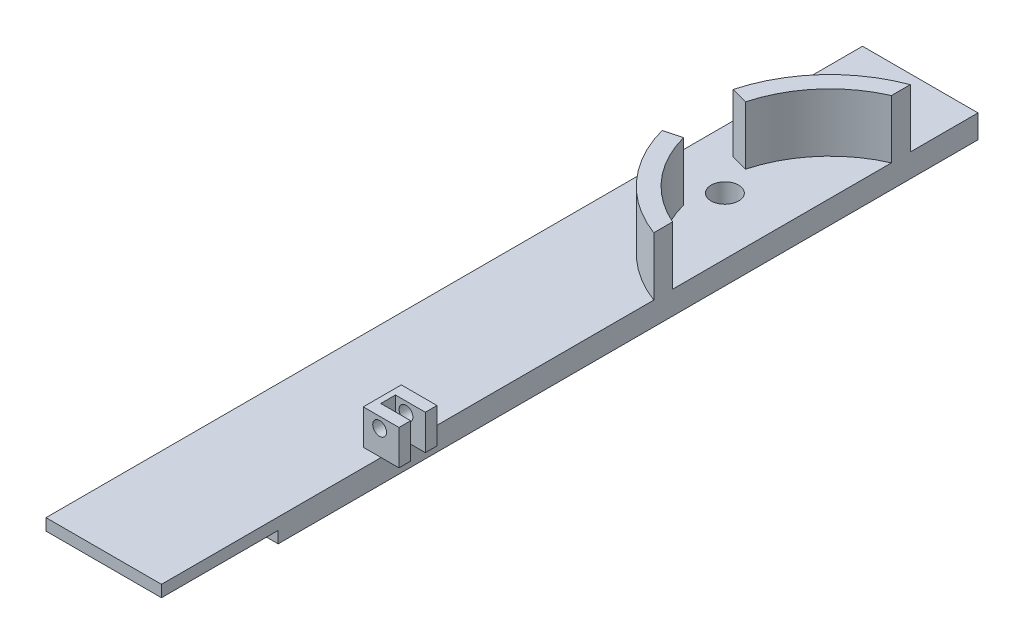
ISO-10303-21;
HEADER;
FILE_DESCRIPTION(('STEP AP214'),'2;1');
FILE_NAME('part.step','',(''),(''),'','','');
FILE_SCHEMA(('AUTOMOTIVE_DESIGN { 1 0 10303 214 1 1 1 1 }'));
ENDSEC;
DATA;
#1=APPLICATION_CONTEXT('core data for automotive mechanical design processes');
#2=APPLICATION_PROTOCOL_DEFINITION('international standard','automotive_design',2000,#1);
#3=PRODUCT_CONTEXT('',#1,'mechanical');
#4=PRODUCT('Part','Part','',(#3));
#5=PRODUCT_RELATED_PRODUCT_CATEGORY('part','',(#4));
#6=PRODUCT_DEFINITION_FORMATION('','',#4);
#7=PRODUCT_DEFINITION_CONTEXT('part definition',#1,'design');
#8=PRODUCT_DEFINITION('design','',#6,#7);
#9=PRODUCT_DEFINITION_SHAPE('','',#8);
#10=(LENGTH_UNIT() NAMED_UNIT(*) SI_UNIT(.MILLI.,.METRE.));
#11=(NAMED_UNIT(*) PLANE_ANGLE_UNIT() SI_UNIT($,.RADIAN.));
#12=(NAMED_UNIT(*) SI_UNIT($,.STERADIAN.) SOLID_ANGLE_UNIT());
#13=UNCERTAINTY_MEASURE_WITH_UNIT(LENGTH_MEASURE(1.E-05),#10,'distance_accuracy_value','');
#14=(GEOMETRIC_REPRESENTATION_CONTEXT(3) GLOBAL_UNCERTAINTY_ASSIGNED_CONTEXT((#13)) GLOBAL_UNIT_ASSIGNED_CONTEXT((#10,
#11,#12)) REPRESENTATION_CONTEXT('',''));
#15=CARTESIAN_POINT('',(0.,0.,0.));
#16=DIRECTION('',(0.,0.,1.));
#17=DIRECTION('',(1.,0.,0.));
#18=AXIS2_PLACEMENT_3D('',#15,#16,#17);
#19=CARTESIAN_POINT('',(0.,5.08,0.));
#20=DIRECTION('',(0.,1.,0.));
#21=DIRECTION('',(0.,0.,1.));
#22=AXIS2_PLACEMENT_3D('',#19,#20,#21);
#23=PLANE('',#22);
#24=CARTESIAN_POINT('',(2.06683428571431,5.08,8.76082285714286));
#25=DIRECTION('',(0.,1.,0.));
#26=DIRECTION('',(0.,0.,1.));
#27=AXIS2_PLACEMENT_3D('',#24,#25,#26);
#28=CIRCLE('',#27,3.);
#29=CARTESIAN_POINT('',(2.06683428571431,5.08,5.76082285714286));
#30=VERTEX_POINT('',#29);
#31=EDGE_CURVE('E393',#30,#30,#28,.T.);
#32=ORIENTED_EDGE('',*,*,#31,.F.);
#33=EDGE_LOOP('',(#32));
#34=FACE_BOUND('',#33,.T.);
#35=DIRECTION('',(0.,0.,-1.));
#36=VECTOR('',#35,1.);
#37=CARTESIAN_POINT('',(10.6396530557143,5.08,0.));
#38=LINE('',#37,#36);
#39=CARTESIAN_POINT('',(10.6396530557143,5.08,96.0714137442974));
#40=VERTEX_POINT('',#39);
#41=CARTESIAN_POINT('',(10.6396530557143,5.08,87.7914137442974));
#42=VERTEX_POINT('',#41);
#43=EDGE_CURVE('E140',#40,#42,#38,.T.);
#44=ORIENTED_EDGE('',*,*,#43,.T.);
#45=DIRECTION('',(-1.,0.,0.));
#46=VECTOR('',#45,1.);
#47=CARTESIAN_POINT('',(0.,5.08,87.7914137442974));
#48=LINE('',#47,#46);
#49=CARTESIAN_POINT('',(14.5128342857143,5.08,87.7914137442974));
#50=VERTEX_POINT('',#49);
#51=EDGE_CURVE('E313',#50,#42,#48,.T.);
#52=ORIENTED_EDGE('',*,*,#51,.F.);
#53=DIRECTION('',(0.,0.,-1.));
#54=VECTOR('',#53,1.);
#55=CARTESIAN_POINT('',(14.5128342857143,5.08,-33.9111771428571));
#56=LINE('',#55,#54);
#57=CARTESIAN_POINT('',(14.5128342857143,5.08,36.6926094809878));
#58=VERTEX_POINT('',#57);
#59=EDGE_CURVE('E518',#50,#58,#56,.T.);
#60=ORIENTED_EDGE('',*,*,#59,.T.);
#61=CARTESIAN_POINT('',(24.9268342857143,5.08,8.76082285714286));
#62=DIRECTION('',(0.,1.,0.));
#63=DIRECTION('',(0.,0.,1.));
#64=AXIS2_PLACEMENT_3D('',#61,#62,#63);
#65=CIRCLE('',#64,29.81);
#66=CARTESIAN_POINT('',(-3.86741459596282,5.08,16.476218591649));
#67=VERTEX_POINT('',#66);
#68=EDGE_CURVE('E414',#67,#58,#65,.T.);
#69=ORIENTED_EDGE('',*,*,#68,.F.);
#70=DIRECTION('',(-0.965925826289068,0.,0.258819045102522));
#71=VECTOR('',#70,1.);
#72=CARTESIAN_POINT('',(-3.86741459596282,5.08,16.476218591649));
#73=LINE('',#72,#71);
#74=CARTESIAN_POINT('',(-0.187237197801459,5.08,15.4901180298084));
#75=VERTEX_POINT('',#74);
#76=EDGE_CURVE('E418',#75,#67,#73,.T.);
#77=ORIENTED_EDGE('',*,*,#76,.F.);
#78=CARTESIAN_POINT('',(24.9268342857143,5.08,8.76082285714286));
#79=DIRECTION('',(0.,-1.,0.));
#80=DIRECTION('',(0.,0.,1.));
#81=AXIS2_PLACEMENT_3D('',#78,#79,#80);
#82=CIRCLE('',#81,26.);
#83=CARTESIAN_POINT('',(14.5128342857143,5.08,32.5841014728162));
#84=VERTEX_POINT('',#83);
#85=EDGE_CURVE('E423',#84,#75,#82,.T.);
#86=ORIENTED_EDGE('',*,*,#85,.F.);
#87=CARTESIAN_POINT('',(14.5128342857143,5.08,-15.0624557585305));
#88=VERTEX_POINT('',#87);
#89=EDGE_CURVE('E569',#84,#88,#56,.T.);
#90=ORIENTED_EDGE('',*,*,#89,.T.);
#91=CARTESIAN_POINT('',(24.9268342857143,5.08,8.76082285714286));
#92=DIRECTION('',(0.,-1.,0.));
#93=DIRECTION('',(0.,0.,1.));
#94=AXIS2_PLACEMENT_3D('',#91,#92,#93);
#95=CIRCLE('',#94,26.);
#96=CARTESIAN_POINT('',(-0.187237197801463,5.08,2.0315276844773));
#97=VERTEX_POINT('',#96);
#98=EDGE_CURVE('E444',#97,#88,#95,.T.);
#99=ORIENTED_EDGE('',*,*,#98,.F.);
#100=DIRECTION('',(0.965925826289068,0.,0.258819045102521));
#101=VECTOR('',#100,1.);
#102=CARTESIAN_POINT('',(-3.86741459596282,5.08,1.0454271226367));
#103=LINE('',#102,#101);
#104=CARTESIAN_POINT('',(-3.86741459596282,5.08,1.0454271226367));
#105=VERTEX_POINT('',#104);
#106=EDGE_CURVE('E457',#105,#97,#103,.T.);
#107=ORIENTED_EDGE('',*,*,#106,.F.);
#108=CARTESIAN_POINT('',(24.9268342857143,5.08,8.76082285714286));
#109=DIRECTION('',(0.,1.,0.));
#110=DIRECTION('',(0.,0.,1.));
#111=AXIS2_PLACEMENT_3D('',#108,#109,#110);
#112=CIRCLE('',#111,29.81);
#113=CARTESIAN_POINT('',(14.5128342857143,5.08,-19.170963766702));
#114=VERTEX_POINT('',#113);
#115=EDGE_CURVE('E427',#114,#105,#112,.T.);
#116=ORIENTED_EDGE('',*,*,#115,.F.);
#117=CARTESIAN_POINT('',(14.5128342857143,5.08,-33.9111771428571));
#118=VERTEX_POINT('',#117);
#119=EDGE_CURVE('E512',#114,#118,#56,.T.);
#120=ORIENTED_EDGE('',*,*,#119,.T.);
#121=DIRECTION('',(-1.,0.,0.));
#122=VECTOR('',#121,1.);
#123=CARTESIAN_POINT('',(-10.6331657142857,5.08,-33.9111771428571));
#124=LINE('',#123,#122);
#125=CARTESIAN_POINT('',(-10.6331657142857,5.08,-33.9111771428571));
#126=VERTEX_POINT('',#125);
#127=EDGE_CURVE('E516',#118,#126,#124,.T.);
#128=ORIENTED_EDGE('',*,*,#127,.T.);
#129=DIRECTION('',(0.,0.,1.));
#130=VECTOR('',#129,1.);
#131=CARTESIAN_POINT('',(-10.6331657142857,5.08,-33.9111771428571));
#132=LINE('',#131,#130);
#133=CARTESIAN_POINT('',(-10.6331657142857,5.08,143.888822857143));
#134=VERTEX_POINT('',#133);
#135=EDGE_CURVE('E504',#126,#134,#132,.T.);
#136=ORIENTED_EDGE('',*,*,#135,.T.);
#137=DIRECTION('',(1.,0.,0.));
#138=VECTOR('',#137,1.);
#139=CARTESIAN_POINT('',(-10.6331657142857,5.08,143.888822857143));
#140=LINE('',#139,#138);
#141=CARTESIAN_POINT('',(14.5128342857143,5.08,143.888822857143));
#142=VERTEX_POINT('',#141);
#143=EDGE_CURVE('E508',#134,#142,#140,.T.);
#144=ORIENTED_EDGE('',*,*,#143,.T.);
#145=CARTESIAN_POINT('',(14.5128342857143,5.08,96.0714137442974));
#146=VERTEX_POINT('',#145);
#147=EDGE_CURVE('E513',#142,#146,#56,.T.);
#148=ORIENTED_EDGE('',*,*,#147,.T.);
#149=DIRECTION('',(-1.,0.,0.));
#150=VECTOR('',#149,1.);
#151=CARTESIAN_POINT('',(0.,5.08,96.0714137442974));
#152=LINE('',#151,#150);
#153=EDGE_CURVE('E135',#146,#40,#152,.T.);
#154=ORIENTED_EDGE('',*,*,#153,.T.);
#155=EDGE_LOOP('',(#44,#52,#60,#69,#77,#86,#90,#99,#107,#116,#120,#128,#136,#144,#148,#154));
#156=FACE_BOUND('',#155,.T.);
#157=ADVANCED_FACE('F119',(#34,#156),#23,.T.);
#158=DIRECTION('',(-1.,0.,0.));
#159=VECTOR('',#158,1.);
#160=CARTESIAN_POINT('',(0.,5.08,90.3314137442974));
#161=LINE('',#160,#159);
#162=CARTESIAN_POINT('',(14.5128342857143,5.08,90.3314137442974));
#163=VERTEX_POINT('',#162);
#164=CARTESIAN_POINT('',(11.9096530557143,5.08,90.3314137442974));
#165=VERTEX_POINT('',#164);
#166=EDGE_CURVE('E348',#163,#165,#161,.T.);
#167=ORIENTED_EDGE('',*,*,#166,.T.);
#168=DIRECTION('',(0.,0.,1.));
#169=VECTOR('',#168,1.);
#170=CARTESIAN_POINT('',(11.9096530557143,5.08,0.));
#171=LINE('',#170,#169);
#172=CARTESIAN_POINT('',(11.9096530557143,5.08,93.5314137442974));
#173=VERTEX_POINT('',#172);
#174=EDGE_CURVE('E345',#165,#173,#171,.T.);
#175=ORIENTED_EDGE('',*,*,#174,.T.);
#176=DIRECTION('',(-1.,0.,0.));
#177=VECTOR('',#176,1.);
#178=CARTESIAN_POINT('',(0.,5.08,93.5314137442974));
#179=LINE('',#178,#177);
#180=CARTESIAN_POINT('',(14.5128342857143,5.08,93.5314137442974));
#181=VERTEX_POINT('',#180);
#182=EDGE_CURVE('E340',#181,#173,#179,.T.);
#183=ORIENTED_EDGE('',*,*,#182,.F.);
#184=EDGE_CURVE('E576',#181,#163,#56,.T.);
#185=ORIENTED_EDGE('',*,*,#184,.T.);
#186=EDGE_LOOP('',(#167,#175,#183,#185));
#187=FACE_BOUND('',#186,.T.);
#188=ADVANCED_FACE('F639',(#187),#23,.T.);
#189=CARTESIAN_POINT('',(-10.6331657142857,5.08,143.888822857143));
#190=DIRECTION('',(0.,0.,-1.));
#191=DIRECTION('',(-1.,0.,0.));
#192=AXIS2_PLACEMENT_3D('',#189,#190,#191);
#193=PLANE('',#192);
#194=DIRECTION('',(-1.,0.,0.));
#195=VECTOR('',#194,1.);
#196=CARTESIAN_POINT('',(-10.6331657142857,2.54,143.888822857143));
#197=LINE('',#196,#195);
#198=CARTESIAN_POINT('',(14.5128342857143,2.54,143.888822857143));
#199=VERTEX_POINT('',#198);
#200=CARTESIAN_POINT('',(-10.6331657142857,2.54,143.888822857143));
#201=VERTEX_POINT('',#200);
#202=EDGE_CURVE('E491',#199,#201,#197,.T.);
#203=ORIENTED_EDGE('',*,*,#202,.F.);
#204=DIRECTION('',(0.,-1.,0.));
#205=VECTOR('',#204,1.);
#206=CARTESIAN_POINT('',(14.5128342857143,5.08,143.888822857143));
#207=LINE('',#206,#205);
#208=EDGE_CURVE('E128',#142,#199,#207,.T.);
#209=ORIENTED_EDGE('',*,*,#208,.F.);
#210=ORIENTED_EDGE('',*,*,#143,.F.);
#211=DIRECTION('',(0.,-1.,0.));
#212=VECTOR('',#211,1.);
#213=CARTESIAN_POINT('',(-10.6331657142857,5.08,143.888822857143));
#214=LINE('',#213,#212);
#215=EDGE_CURVE('E12',#134,#201,#214,.T.);
#216=ORIENTED_EDGE('',*,*,#215,.T.);
#217=EDGE_LOOP('',(#203,#209,#210,#216));
#218=FACE_BOUND('',#217,.T.);
#219=ADVANCED_FACE('F545',(#218),#193,.F.);
#220=CARTESIAN_POINT('',(-10.6331657142857,5.08,-33.9111771428571));
#221=DIRECTION('',(1.,0.,0.));
#222=DIRECTION('',(0.,0.,-1.));
#223=AXIS2_PLACEMENT_3D('',#220,#221,#222);
#224=PLANE('',#223);
#225=DIRECTION('',(0.,0.,1.));
#226=VECTOR('',#225,1.);
#227=CARTESIAN_POINT('',(-10.6331657142857,0.,-33.9111771428571));
#228=LINE('',#227,#226);
#229=CARTESIAN_POINT('',(-10.6331657142857,0.,-33.9111771428571));
#230=VERTEX_POINT('',#229);
#231=CARTESIAN_POINT('',(-10.6331657142857,0.,118.488822857143));
#232=VERTEX_POINT('',#231);
#233=EDGE_CURVE('E501',#230,#232,#228,.T.);
#234=ORIENTED_EDGE('',*,*,#233,.T.);
#235=DIRECTION('',(0.,-1.,0.));
#236=VECTOR('',#235,1.);
#237=CARTESIAN_POINT('',(-10.6331657142857,2.54,118.488822857143));
#238=LINE('',#237,#236);
#239=CARTESIAN_POINT('',(-10.6331657142857,2.54,118.488822857143));
#240=VERTEX_POINT('',#239);
#241=EDGE_CURVE('E494',#240,#232,#238,.T.);
#242=ORIENTED_EDGE('',*,*,#241,.F.);
#243=DIRECTION('',(0.,0.,-1.));
#244=VECTOR('',#243,1.);
#245=CARTESIAN_POINT('',(-10.6331657142857,2.54,143.888822857143));
#246=LINE('',#245,#244);
#247=EDGE_CURVE('E480',#201,#240,#246,.T.);
#248=ORIENTED_EDGE('',*,*,#247,.F.);
#249=ORIENTED_EDGE('',*,*,#215,.F.);
#250=ORIENTED_EDGE('',*,*,#135,.F.);
#251=DIRECTION('',(0.,-1.,0.));
#252=VECTOR('',#251,1.);
#253=CARTESIAN_POINT('',(-10.6331657142857,5.08,-33.9111771428571));
#254=LINE('',#253,#252);
#255=EDGE_CURVE('E521',#126,#230,#254,.T.);
#256=ORIENTED_EDGE('',*,*,#255,.T.);
#257=EDGE_LOOP('',(#234,#242,#248,#249,#250,#256));
#258=FACE_BOUND('',#257,.T.);
#259=ADVANCED_FACE('F121',(#258),#224,.F.);
#260=CARTESIAN_POINT('',(14.5128342857143,5.08,-33.9111771428571));
#261=DIRECTION('',(-1.,0.,0.));
#262=DIRECTION('',(0.,0.,1.));
#263=AXIS2_PLACEMENT_3D('',#260,#261,#262);
#264=PLANE('',#263);
#265=DIRECTION('',(0.,0.,1.));
#266=VECTOR('',#265,1.);
#267=CARTESIAN_POINT('',(14.5128342857143,2.54,143.888822857143));
#268=LINE('',#267,#266);
#269=CARTESIAN_POINT('',(14.5128342857143,2.54,118.488822857143));
#270=VERTEX_POINT('',#269);
#271=EDGE_CURVE('E488',#270,#199,#268,.T.);
#272=ORIENTED_EDGE('',*,*,#271,.F.);
#273=DIRECTION('',(0.,-1.,0.));
#274=VECTOR('',#273,1.);
#275=CARTESIAN_POINT('',(14.5128342857143,2.54,118.488822857143));
#276=LINE('',#275,#274);
#277=CARTESIAN_POINT('',(14.5128342857143,0.,118.488822857143));
#278=VERTEX_POINT('',#277);
#279=EDGE_CURVE('E497',#270,#278,#276,.T.);
#280=ORIENTED_EDGE('',*,*,#279,.T.);
#281=DIRECTION('',(0.,0.,-1.));
#282=VECTOR('',#281,1.);
#283=CARTESIAN_POINT('',(14.5128342857143,0.,-33.9111771428571));
#284=LINE('',#283,#282);
#285=CARTESIAN_POINT('',(14.5128342857143,0.,-33.9111771428571));
#286=VERTEX_POINT('',#285);
#287=EDGE_CURVE('E525',#278,#286,#284,.T.);
#288=ORIENTED_EDGE('',*,*,#287,.T.);
#289=DIRECTION('',(0.,-1.,0.));
#290=VECTOR('',#289,1.);
#291=CARTESIAN_POINT('',(14.5128342857143,5.08,-33.9111771428571));
#292=LINE('',#291,#290);
#293=EDGE_CURVE('E533',#118,#286,#292,.T.);
#294=ORIENTED_EDGE('',*,*,#293,.F.);
#295=ORIENTED_EDGE('',*,*,#119,.F.);
#296=DIRECTION('',(0.,-1.,0.));
#297=VECTOR('',#296,1.);
#298=CARTESIAN_POINT('',(14.5128342857143,17.78,-19.170963766702));
#299=LINE('',#298,#297);
#300=CARTESIAN_POINT('',(14.5128342857143,17.78,-19.170963766702));
#301=VERTEX_POINT('',#300);
#302=EDGE_CURVE('E453',#301,#114,#299,.T.);
#303=ORIENTED_EDGE('',*,*,#302,.F.);
#304=DIRECTION('',(0.,0.,-1.));
#305=VECTOR('',#304,1.);
#306=CARTESIAN_POINT('',(14.5128342857143,17.78,-19.170963766702));
#307=LINE('',#306,#305);
#308=CARTESIAN_POINT('',(14.5128342857143,17.78,-15.0624557585305));
#309=VERTEX_POINT('',#308);
#310=EDGE_CURVE('E450',#309,#301,#307,.T.);
#311=ORIENTED_EDGE('',*,*,#310,.F.);
#312=DIRECTION('',(0.,-1.,0.));
#313=VECTOR('',#312,1.);
#314=CARTESIAN_POINT('',(14.5128342857143,17.78,-15.0624557585305));
#315=LINE('',#314,#313);
#316=EDGE_CURVE('E467',#309,#88,#315,.T.);
#317=ORIENTED_EDGE('',*,*,#316,.T.);
#318=ORIENTED_EDGE('',*,*,#89,.F.);
#319=DIRECTION('',(0.,-1.,0.));
#320=VECTOR('',#319,1.);
#321=CARTESIAN_POINT('',(14.5128342857143,17.78,32.5841014728162));
#322=LINE('',#321,#320);
#323=CARTESIAN_POINT('',(14.5128342857143,17.78,32.5841014728162));
#324=VERTEX_POINT('',#323);
#325=EDGE_CURVE('E409',#324,#84,#322,.T.);
#326=ORIENTED_EDGE('',*,*,#325,.F.);
#327=DIRECTION('',(0.,0.,-1.));
#328=VECTOR('',#327,1.);
#329=CARTESIAN_POINT('',(14.5128342857143,17.78,32.5841014728162));
#330=LINE('',#329,#328);
#331=CARTESIAN_POINT('',(14.5128342857143,17.78,36.6926094809877));
#332=VERTEX_POINT('',#331);
#333=EDGE_CURVE('E413',#332,#324,#330,.T.);
#334=ORIENTED_EDGE('',*,*,#333,.F.);
#335=DIRECTION('',(0.,-1.,0.));
#336=VECTOR('',#335,1.);
#337=CARTESIAN_POINT('',(14.5128342857143,17.78,36.6926094809877));
#338=LINE('',#337,#336);
#339=EDGE_CURVE('E405',#332,#58,#338,.T.);
#340=ORIENTED_EDGE('',*,*,#339,.T.);
#341=ORIENTED_EDGE('',*,*,#59,.F.);
#342=EDGE_CURVE('E573',#163,#50,#56,.T.);
#343=ORIENTED_EDGE('',*,*,#342,.F.);
#344=ORIENTED_EDGE('',*,*,#184,.F.);
#345=EDGE_CURVE('E517',#146,#181,#56,.T.);
#346=ORIENTED_EDGE('',*,*,#345,.F.);
#347=ORIENTED_EDGE('',*,*,#147,.F.);
#348=ORIENTED_EDGE('',*,*,#208,.T.);
#349=EDGE_LOOP('',(#272,#280,#288,#294,#295,#303,#311,#317,#318,#326,#334,#340,#341,#343,#344,
#346,#347,#348));
#350=FACE_BOUND('',#349,.T.);
#351=ADVANCED_FACE('F542',(#350),#264,.F.);
#352=CARTESIAN_POINT('',(-10.6331657142857,5.08,-33.9111771428571));
#353=DIRECTION('',(0.,0.,1.));
#354=DIRECTION('',(1.,0.,0.));
#355=AXIS2_PLACEMENT_3D('',#352,#353,#354);
#356=PLANE('',#355);
#357=DIRECTION('',(-1.,0.,0.));
#358=VECTOR('',#357,1.);
#359=CARTESIAN_POINT('',(-10.6331657142857,0.,-33.9111771428571));
#360=LINE('',#359,#358);
#361=EDGE_CURVE('E509',#286,#230,#360,.T.);
#362=ORIENTED_EDGE('',*,*,#361,.T.);
#363=ORIENTED_EDGE('',*,*,#255,.F.);
#364=ORIENTED_EDGE('',*,*,#127,.F.);
#365=ORIENTED_EDGE('',*,*,#293,.T.);
#366=EDGE_LOOP('',(#362,#363,#364,#365));
#367=FACE_BOUND('',#366,.T.);
#368=ADVANCED_FACE('F565',(#367),#356,.F.);
#369=CARTESIAN_POINT('',(0.,0.,0.));
#370=DIRECTION('',(0.,1.,0.));
#371=DIRECTION('',(0.,0.,1.));
#372=AXIS2_PLACEMENT_3D('',#369,#370,#371);
#373=PLANE('',#372);
#374=CARTESIAN_POINT('',(2.06683428571431,0.,8.76082285714286));
#375=DIRECTION('',(0.,-1.,0.));
#376=DIRECTION('',(0.,0.,-1.));
#377=AXIS2_PLACEMENT_3D('',#374,#375,#376);
#378=CIRCLE('',#377,3.);
#379=CARTESIAN_POINT('',(2.06683428571431,0.,5.76082285714286));
#380=VERTEX_POINT('',#379);
#381=EDGE_CURVE('E300',#380,#380,#378,.T.);
#382=ORIENTED_EDGE('',*,*,#381,.F.);
#383=EDGE_LOOP('',(#382));
#384=FACE_BOUND('',#383,.T.);
#385=ORIENTED_EDGE('',*,*,#287,.F.);
#386=DIRECTION('',(1.,0.,0.));
#387=VECTOR('',#386,1.);
#388=CARTESIAN_POINT('',(-10.6331657142857,0.,118.488822857143));
#389=LINE('',#388,#387);
#390=EDGE_CURVE('E479',#232,#278,#389,.T.);
#391=ORIENTED_EDGE('',*,*,#390,.F.);
#392=ORIENTED_EDGE('',*,*,#233,.F.);
#393=ORIENTED_EDGE('',*,*,#361,.F.);
#394=EDGE_LOOP('',(#385,#391,#392,#393));
#395=FACE_BOUND('',#394,.T.);
#396=ADVANCED_FACE('F559',(#384,#395),#373,.F.);
#397=CARTESIAN_POINT('',(-10.6331657142857,2.54,118.488822857143));
#398=DIRECTION('',(0.,0.,-1.));
#399=DIRECTION('',(-1.,0.,0.));
#400=AXIS2_PLACEMENT_3D('',#397,#398,#399);
#401=PLANE('',#400);
#402=ORIENTED_EDGE('',*,*,#390,.T.);
#403=ORIENTED_EDGE('',*,*,#279,.F.);
#404=DIRECTION('',(1.,0.,0.));
#405=VECTOR('',#404,1.);
#406=CARTESIAN_POINT('',(-10.6331657142857,2.54,118.488822857143));
#407=LINE('',#406,#405);
#408=EDGE_CURVE('E484',#240,#270,#407,.T.);
#409=ORIENTED_EDGE('',*,*,#408,.F.);
#410=ORIENTED_EDGE('',*,*,#241,.T.);
#411=EDGE_LOOP('',(#402,#403,#409,#410));
#412=FACE_BOUND('',#411,.T.);
#413=ADVANCED_FACE('F556',(#412),#401,.F.);
#414=CARTESIAN_POINT('',(0.,2.54,0.));
#415=DIRECTION('',(0.,-1.,0.));
#416=DIRECTION('',(0.,0.,-1.));
#417=AXIS2_PLACEMENT_3D('',#414,#415,#416);
#418=PLANE('',#417);
#419=ORIENTED_EDGE('',*,*,#247,.T.);
#420=ORIENTED_EDGE('',*,*,#408,.T.);
#421=ORIENTED_EDGE('',*,*,#271,.T.);
#422=ORIENTED_EDGE('',*,*,#202,.T.);
#423=EDGE_LOOP('',(#419,#420,#421,#422));
#424=FACE_BOUND('',#423,.T.);
#425=ADVANCED_FACE('F549',(#424),#418,.T.);
#426=CARTESIAN_POINT('',(24.9268342857143,17.78,8.76082285714286));
#427=DIRECTION('',(0.,-1.,0.));
#428=DIRECTION('',(0.,0.,-1.));
#429=AXIS2_PLACEMENT_3D('',#426,#427,#428);
#430=CYLINDRICAL_SURFACE('',#429,29.81);
#431=ORIENTED_EDGE('',*,*,#115,.T.);
#432=DIRECTION('',(0.,-1.,0.));
#433=VECTOR('',#432,1.);
#434=CARTESIAN_POINT('',(-3.86741459596282,17.78,1.0454271226367));
#435=LINE('',#434,#433);
#436=CARTESIAN_POINT('',(-3.86741459596282,17.78,1.0454271226367));
#437=VERTEX_POINT('',#436);
#438=EDGE_CURVE('E475',#437,#105,#435,.T.);
#439=ORIENTED_EDGE('',*,*,#438,.F.);
#440=CARTESIAN_POINT('',(24.9268342857143,17.78,8.76082285714286));
#441=DIRECTION('',(0.,1.,0.));
#442=DIRECTION('',(0.,0.,1.));
#443=AXIS2_PLACEMENT_3D('',#440,#441,#442);
#444=CIRCLE('',#443,29.81);
#445=EDGE_CURVE('E439',#301,#437,#444,.T.);
#446=ORIENTED_EDGE('',*,*,#445,.F.);
#447=ORIENTED_EDGE('',*,*,#302,.T.);
#448=EDGE_LOOP('',(#431,#439,#446,#447));
#449=FACE_BOUND('',#448,.T.);
#450=ADVANCED_FACE('F677',(#449),#430,.T.);
#451=CARTESIAN_POINT('',(-3.86741459596282,17.78,1.0454271226367));
#452=DIRECTION('',(0.258819045102521,0.,-0.965925826289068));
#453=DIRECTION('',(-0.965925826289068,0.,-0.258819045102521));
#454=AXIS2_PLACEMENT_3D('',#451,#452,#453);
#455=PLANE('',#454);
#456=ORIENTED_EDGE('',*,*,#106,.T.);
#457=DIRECTION('',(0.,-1.,0.));
#458=VECTOR('',#457,1.);
#459=CARTESIAN_POINT('',(-0.187237197801463,17.78,2.0315276844773));
#460=LINE('',#459,#458);
#461=CARTESIAN_POINT('',(-0.187237197801463,17.78,2.0315276844773));
#462=VERTEX_POINT('',#461);
#463=EDGE_CURVE('E471',#462,#97,#460,.T.);
#464=ORIENTED_EDGE('',*,*,#463,.F.);
#465=DIRECTION('',(0.965925826289068,0.,0.258819045102521));
#466=VECTOR('',#465,1.);
#467=CARTESIAN_POINT('',(-3.86741459596282,17.78,1.0454271226367));
#468=LINE('',#467,#466);
#469=EDGE_CURVE('E443',#437,#462,#468,.T.);
#470=ORIENTED_EDGE('',*,*,#469,.F.);
#471=ORIENTED_EDGE('',*,*,#438,.T.);
#472=EDGE_LOOP('',(#456,#464,#470,#471));
#473=FACE_BOUND('',#472,.T.);
#474=ADVANCED_FACE('F685',(#473),#455,.F.);
#475=CARTESIAN_POINT('',(24.9268342857143,17.78,8.76082285714286));
#476=DIRECTION('',(0.,-1.,0.));
#477=DIRECTION('',(0.,0.,-1.));
#478=AXIS2_PLACEMENT_3D('',#475,#476,#477);
#479=CYLINDRICAL_SURFACE('',#478,26.);
#480=ORIENTED_EDGE('',*,*,#98,.T.);
#481=ORIENTED_EDGE('',*,*,#316,.F.);
#482=CARTESIAN_POINT('',(24.9268342857143,17.78,8.76082285714286));
#483=DIRECTION('',(0.,-1.,0.));
#484=DIRECTION('',(0.,0.,1.));
#485=AXIS2_PLACEMENT_3D('',#482,#483,#484);
#486=CIRCLE('',#485,26.);
#487=EDGE_CURVE('E447',#462,#309,#486,.T.);
#488=ORIENTED_EDGE('',*,*,#487,.F.);
#489=ORIENTED_EDGE('',*,*,#463,.T.);
#490=EDGE_LOOP('',(#480,#481,#488,#489));
#491=FACE_BOUND('',#490,.T.);
#492=ADVANCED_FACE('F695',(#491),#479,.F.);
#493=CARTESIAN_POINT('',(24.9268342857143,17.78,8.76082285714286));
#494=DIRECTION('',(0.,1.,0.));
#495=DIRECTION('',(0.,0.,1.));
#496=AXIS2_PLACEMENT_3D('',#493,#494,#495);
#497=PLANE('',#496);
#498=ORIENTED_EDGE('',*,*,#445,.T.);
#499=ORIENTED_EDGE('',*,*,#469,.T.);
#500=ORIENTED_EDGE('',*,*,#487,.T.);
#501=ORIENTED_EDGE('',*,*,#310,.T.);
#502=EDGE_LOOP('',(#498,#499,#500,#501));
#503=FACE_BOUND('',#502,.T.);
#504=ADVANCED_FACE('F704',(#503),#497,.T.);
#505=CARTESIAN_POINT('',(24.9268342857143,17.78,8.76082285714286));
#506=DIRECTION('',(0.,-1.,0.));
#507=DIRECTION('',(0.,0.,-1.));
#508=AXIS2_PLACEMENT_3D('',#505,#506,#507);
#509=CYLINDRICAL_SURFACE('',#508,26.);
#510=ORIENTED_EDGE('',*,*,#85,.T.);
#511=DIRECTION('',(0.,-1.,0.));
#512=VECTOR('',#511,1.);
#513=CARTESIAN_POINT('',(-0.187237197801459,17.78,15.4901180298084));
#514=LINE('',#513,#512);
#515=CARTESIAN_POINT('',(-0.187237197801459,17.78,15.4901180298084));
#516=VERTEX_POINT('',#515);
#517=EDGE_CURVE('E397',#516,#75,#514,.T.);
#518=ORIENTED_EDGE('',*,*,#517,.F.);
#519=CARTESIAN_POINT('',(24.9268342857143,17.78,8.76082285714286));
#520=DIRECTION('',(0.,-1.,0.));
#521=DIRECTION('',(0.,0.,1.));
#522=AXIS2_PLACEMENT_3D('',#519,#520,#521);
#523=CIRCLE('',#522,26.);
#524=EDGE_CURVE('E419',#324,#516,#523,.T.);
#525=ORIENTED_EDGE('',*,*,#524,.F.);
#526=ORIENTED_EDGE('',*,*,#325,.T.);
#527=EDGE_LOOP('',(#510,#518,#525,#526));
#528=FACE_BOUND('',#527,.T.);
#529=ADVANCED_FACE('F713',(#528),#509,.F.);
#530=CARTESIAN_POINT('',(-3.86741459596282,17.78,16.476218591649));
#531=DIRECTION('',(0.258819045102522,0.,0.965925826289068));
#532=DIRECTION('',(0.965925826289068,0.,-0.258819045102522));
#533=AXIS2_PLACEMENT_3D('',#530,#531,#532);
#534=PLANE('',#533);
#535=ORIENTED_EDGE('',*,*,#76,.T.);
#536=DIRECTION('',(0.,-1.,0.));
#537=VECTOR('',#536,1.);
#538=CARTESIAN_POINT('',(-3.86741459596282,17.78,16.476218591649));
#539=LINE('',#538,#537);
#540=CARTESIAN_POINT('',(-3.86741459596282,17.78,16.476218591649));
#541=VERTEX_POINT('',#540);
#542=EDGE_CURVE('E401',#541,#67,#539,.T.);
#543=ORIENTED_EDGE('',*,*,#542,.F.);
#544=DIRECTION('',(-0.965925826289068,0.,0.258819045102522));
#545=VECTOR('',#544,1.);
#546=CARTESIAN_POINT('',(-3.86741459596282,17.78,16.476218591649));
#547=LINE('',#546,#545);
#548=EDGE_CURVE('E433',#516,#541,#547,.T.);
#549=ORIENTED_EDGE('',*,*,#548,.F.);
#550=ORIENTED_EDGE('',*,*,#517,.T.);
#551=EDGE_LOOP('',(#535,#543,#549,#550));
#552=FACE_BOUND('',#551,.T.);
#553=ADVANCED_FACE('F722',(#552),#534,.F.);
#554=CARTESIAN_POINT('',(24.9268342857143,17.78,8.76082285714286));
#555=DIRECTION('',(0.,-1.,0.));
#556=DIRECTION('',(0.,0.,-1.));
#557=AXIS2_PLACEMENT_3D('',#554,#555,#556);
#558=CYLINDRICAL_SURFACE('',#557,29.81);
#559=ORIENTED_EDGE('',*,*,#68,.T.);
#560=ORIENTED_EDGE('',*,*,#339,.F.);
#561=CARTESIAN_POINT('',(24.9268342857143,17.78,8.76082285714286));
#562=DIRECTION('',(0.,1.,0.));
#563=DIRECTION('',(0.,0.,1.));
#564=AXIS2_PLACEMENT_3D('',#561,#562,#563);
#565=CIRCLE('',#564,29.81);
#566=EDGE_CURVE('E430',#541,#332,#565,.T.);
#567=ORIENTED_EDGE('',*,*,#566,.F.);
#568=ORIENTED_EDGE('',*,*,#542,.T.);
#569=EDGE_LOOP('',(#559,#560,#567,#568));
#570=FACE_BOUND('',#569,.T.);
#571=ADVANCED_FACE('F731',(#570),#558,.T.);
#572=CARTESIAN_POINT('',(24.9268342857143,17.78,8.76082285714286));
#573=DIRECTION('',(0.,1.,0.));
#574=DIRECTION('',(0.,0.,1.));
#575=AXIS2_PLACEMENT_3D('',#572,#573,#574);
#576=PLANE('',#575);
#577=ORIENTED_EDGE('',*,*,#524,.T.);
#578=ORIENTED_EDGE('',*,*,#548,.T.);
#579=ORIENTED_EDGE('',*,*,#566,.T.);
#580=ORIENTED_EDGE('',*,*,#333,.T.);
#581=EDGE_LOOP('',(#577,#578,#579,#580));
#582=FACE_BOUND('',#581,.T.);
#583=ADVANCED_FACE('F740',(#582),#576,.T.);
#584=CARTESIAN_POINT('',(2.06683428571431,17.78,8.76082285714286));
#585=DIRECTION('',(0.,-1.,0.));
#586=DIRECTION('',(0.,0.,-1.));
#587=AXIS2_PLACEMENT_3D('',#584,#585,#586);
#588=CYLINDRICAL_SURFACE('',#587,3.);
#589=CARTESIAN_POINT('',(2.06683428571431,5.08,5.76082285714286));
#590=CARTESIAN_POINT('',(2.06683428571431,5.02708333333333,5.76082285714286));
#591=CARTESIAN_POINT('',(2.06683428571431,4.97416666666667,5.76082285714286));
#592=CARTESIAN_POINT('',(2.06683428571431,4.86833333333333,5.76082285714286));
#593=CARTESIAN_POINT('',(2.06683428571431,4.81541666666667,5.76082285714286));
#594=CARTESIAN_POINT('',(2.06683428571431,4.70958333333333,5.76082285714286));
#595=CARTESIAN_POINT('',(2.06683428571431,4.65666666666667,5.76082285714286));
#596=CARTESIAN_POINT('',(2.06683428571431,4.55083333333333,5.76082285714286));
#597=CARTESIAN_POINT('',(2.06683428571431,4.49791666666667,5.76082285714286));
#598=CARTESIAN_POINT('',(2.06683428571431,4.39208333333333,5.76082285714286));
#599=CARTESIAN_POINT('',(2.06683428571431,4.33916666666667,5.76082285714286));
#600=CARTESIAN_POINT('',(2.06683428571431,4.23333333333333,5.76082285714286));
#601=CARTESIAN_POINT('',(2.06683428571431,4.18041666666667,5.76082285714286));
#602=CARTESIAN_POINT('',(2.06683428571431,4.07458333333333,5.76082285714286));
#603=CARTESIAN_POINT('',(2.06683428571431,4.02166666666667,5.76082285714286));
#604=CARTESIAN_POINT('',(2.06683428571431,3.91583333333333,5.76082285714286));
#605=CARTESIAN_POINT('',(2.06683428571431,3.86291666666667,5.76082285714286));
#606=CARTESIAN_POINT('',(2.06683428571431,3.75708333333333,5.76082285714286));
#607=CARTESIAN_POINT('',(2.06683428571431,3.70416666666667,5.76082285714286));
#608=CARTESIAN_POINT('',(2.06683428571431,3.59833333333333,5.76082285714286));
#609=CARTESIAN_POINT('',(2.06683428571431,3.54541666666667,5.76082285714286));
#610=CARTESIAN_POINT('',(2.06683428571431,3.43958333333333,5.76082285714286));
#611=CARTESIAN_POINT('',(2.06683428571431,3.38666666666666,5.76082285714286));
#612=CARTESIAN_POINT('',(2.06683428571431,3.28083333333333,5.76082285714286));
#613=CARTESIAN_POINT('',(2.06683428571431,3.22791666666667,5.76082285714286));
#614=CARTESIAN_POINT('',(2.06683428571431,3.12208333333333,5.76082285714286));
#615=CARTESIAN_POINT('',(2.06683428571431,3.06916666666667,5.76082285714286));
#616=CARTESIAN_POINT('',(2.06683428571431,2.96333333333333,5.76082285714286));
#617=CARTESIAN_POINT('',(2.06683428571431,2.91041666666667,5.76082285714286));
#618=CARTESIAN_POINT('',(2.06683428571431,2.80458333333333,5.76082285714286));
#619=CARTESIAN_POINT('',(2.06683428571431,2.75166666666666,5.76082285714286));
#620=CARTESIAN_POINT('',(2.06683428571431,2.64583333333333,5.76082285714286));
#621=CARTESIAN_POINT('',(2.06683428571431,2.59291666666667,5.76082285714286));
#622=CARTESIAN_POINT('',(2.06683428571431,2.48708333333333,5.76082285714286));
#623=CARTESIAN_POINT('',(2.06683428571431,2.43416666666667,5.76082285714286));
#624=CARTESIAN_POINT('',(2.06683428571431,2.32833333333333,5.76082285714286));
#625=CARTESIAN_POINT('',(2.06683428571431,2.27541666666667,5.76082285714286));
#626=CARTESIAN_POINT('',(2.06683428571431,2.16958333333333,5.76082285714286));
#627=CARTESIAN_POINT('',(2.06683428571431,2.11666666666667,5.76082285714286));
#628=CARTESIAN_POINT('',(2.06683428571431,2.01083333333333,5.76082285714286));
#629=CARTESIAN_POINT('',(2.06683428571431,1.95791666666667,5.76082285714286));
#630=CARTESIAN_POINT('',(2.06683428571431,1.85208333333333,5.76082285714286));
#631=CARTESIAN_POINT('',(2.06683428571431,1.79916666666667,5.76082285714286));
#632=CARTESIAN_POINT('',(2.06683428571431,1.69333333333333,5.76082285714286));
#633=CARTESIAN_POINT('',(2.06683428571431,1.64041666666667,5.76082285714286));
#634=CARTESIAN_POINT('',(2.06683428571431,1.53458333333333,5.76082285714286));
#635=CARTESIAN_POINT('',(2.06683428571431,1.48166666666667,5.76082285714286));
#636=CARTESIAN_POINT('',(2.06683428571431,1.37583333333333,5.76082285714286));
#637=CARTESIAN_POINT('',(2.06683428571431,1.32291666666667,5.76082285714286));
#638=CARTESIAN_POINT('',(2.06683428571431,1.21708333333333,5.76082285714286));
#639=CARTESIAN_POINT('',(2.06683428571431,1.16416666666667,5.76082285714286));
#640=CARTESIAN_POINT('',(2.06683428571431,1.05833333333333,5.76082285714286));
#641=CARTESIAN_POINT('',(2.06683428571431,1.00541666666667,5.76082285714286));
#642=CARTESIAN_POINT('',(2.06683428571431,0.899583333333334,5.76082285714286));
#643=CARTESIAN_POINT('',(2.06683428571431,0.846666666666667,5.76082285714286));
#644=CARTESIAN_POINT('',(2.06683428571431,0.740833333333333,5.76082285714286));
#645=CARTESIAN_POINT('',(2.06683428571431,0.687916666666667,5.76082285714286));
#646=CARTESIAN_POINT('',(2.06683428571431,0.582083333333334,5.76082285714286));
#647=CARTESIAN_POINT('',(2.06683428571431,0.529166666666667,5.76082285714286));
#648=CARTESIAN_POINT('',(2.06683428571431,0.423333333333333,5.76082285714286));
#649=CARTESIAN_POINT('',(2.06683428571431,0.370416666666666,5.76082285714286));
#650=CARTESIAN_POINT('',(2.06683428571431,0.264583333333332,5.76082285714286));
#651=CARTESIAN_POINT('',(2.06683428571431,0.211666666666666,5.76082285714286));
#652=CARTESIAN_POINT('',(2.06683428571431,0.105833333333333,5.76082285714286));
#653=CARTESIAN_POINT('',(2.06683428571431,0.0529166666666663,5.76082285714286));
#654=CARTESIAN_POINT('',(2.06683428571431,0.,5.76082285714286));
#655=B_SPLINE_CURVE_WITH_KNOTS('',3,(#589,#590,#591,#592,#593,#594,#595,#596,#597,#598,#599,
#600,#601,#602,#603,#604,#605,#606,#607,#608,#609,#610,#611,#612,#613,#614,#615,#616,#617,#618,
#619,#620,#621,#622,#623,#624,#625,#626,#627,#628,#629,#630,#631,#632,#633,#634,#635,#636,#637,
#638,#639,#640,#641,#642,#643,#644,#645,#646,#647,#648,#649,#650,#651,#652,#653,#654),
.UNSPECIFIED.,.F.,.F.,(4,2,2,2,2,2,2,2,2,2,2,2,2,2,2,2,2,2,2,2,2,2,2,2,2,2,2,2,2,2,2,2,4),(0.,
0.158749999999999,0.3175,0.476250000000001,0.635,0.793749999999999,0.9525,1.11125,1.27,1.42875,
1.5875,1.74625,1.905,2.06375,2.2225,2.38125,2.54,2.69875,2.8575,3.01625,3.175,3.33375,3.4925,
3.65125,3.81,3.96875,4.1275,4.28625,4.445,4.60375,4.7625,4.92125,5.08),.UNSPECIFIED.);
#656=EDGE_CURVE('BSEAM748',#30,#380,#655,.T.);
#657=ORIENTED_EDGE('',*,*,#31,.T.);
#658=ORIENTED_EDGE('',*,*,#381,.T.);
#659=ORIENTED_EDGE('',*,*,#656,.T.);
#660=ORIENTED_EDGE('',*,*,#656,.F.);
#661=EDGE_LOOP('',(#657,#659,#658,#660));
#662=FACE_BOUND('',#661,.T.);
#663=ADVANCED_FACE('F748',(#662),#588,.F.);
#664=CARTESIAN_POINT('',(0.,5.08,0.));
#665=DIRECTION('',(0.,1.,0.));
#666=DIRECTION('',(0.,0.,1.));
#667=AXIS2_PLACEMENT_3D('',#664,#665,#666);
#668=PLANE('',#667);
#669=CARTESIAN_POINT('',(18.4096530557143,5.08,96.0714137442974));
#670=VERTEX_POINT('',#669);
#671=EDGE_CURVE('E336',#670,#146,#152,.T.);
#672=ORIENTED_EDGE('',*,*,#671,.T.);
#673=ORIENTED_EDGE('',*,*,#345,.T.);
#674=CARTESIAN_POINT('',(18.4096530557143,5.08,93.5314137442974));
#675=VERTEX_POINT('',#674);
#676=EDGE_CURVE('E341',#675,#181,#179,.T.);
#677=ORIENTED_EDGE('',*,*,#676,.F.);
#678=DIRECTION('',(0.,0.,1.));
#679=VECTOR('',#678,1.);
#680=CARTESIAN_POINT('',(18.4096530557143,5.08,93.5314137442974));
#681=LINE('',#680,#679);
#682=EDGE_CURVE('E381',#675,#670,#681,.T.);
#683=ORIENTED_EDGE('',*,*,#682,.T.);
#684=EDGE_LOOP('',(#672,#673,#677,#683));
#685=FACE_BOUND('',#684,.T.);
#686=ADVANCED_FACE('F762',(#685),#668,.F.);
#687=CARTESIAN_POINT('',(18.4096530557143,5.08,90.3314137442974));
#688=VERTEX_POINT('',#687);
#689=EDGE_CURVE('E349',#688,#163,#161,.T.);
#690=ORIENTED_EDGE('',*,*,#689,.T.);
#691=ORIENTED_EDGE('',*,*,#342,.T.);
#692=CARTESIAN_POINT('',(18.4096530557143,5.08,87.7914137442974));
#693=VERTEX_POINT('',#692);
#694=EDGE_CURVE('E309',#693,#50,#48,.T.);
#695=ORIENTED_EDGE('',*,*,#694,.F.);
#696=DIRECTION('',(0.,0.,1.));
#697=VECTOR('',#696,1.);
#698=CARTESIAN_POINT('',(18.4096530557143,5.08,87.7914137442974));
#699=LINE('',#698,#697);
#700=EDGE_CURVE('E367',#693,#688,#699,.T.);
#701=ORIENTED_EDGE('',*,*,#700,.T.);
#702=EDGE_LOOP('',(#690,#691,#695,#701));
#703=FACE_BOUND('',#702,.T.);
#704=ADVANCED_FACE('F586',(#703),#668,.F.);
#705=CARTESIAN_POINT('',(0.,12.7,87.7914137442974));
#706=DIRECTION('',(0.,0.,1.));
#707=DIRECTION('',(1.,0.,0.));
#708=AXIS2_PLACEMENT_3D('',#705,#706,#707);
#709=PLANE('',#708);
#710=CARTESIAN_POINT('',(14.1956530557143,10.414,87.7914137442974));
#711=DIRECTION('',(0.,0.,1.));
#712=DIRECTION('',(1.,0.,0.));
#713=AXIS2_PLACEMENT_3D('',#710,#711,#712);
#714=CIRCLE('',#713,1.5);
#715=CARTESIAN_POINT('',(15.6956530557143,10.414,87.7914137442974));
#716=VERTEX_POINT('',#715);
#717=EDGE_CURVE('E316',#716,#716,#714,.T.);
#718=ORIENTED_EDGE('',*,*,#717,.T.);
#719=EDGE_LOOP('',(#718));
#720=FACE_BOUND('',#719,.T.);
#721=ORIENTED_EDGE('',*,*,#694,.T.);
#722=ORIENTED_EDGE('',*,*,#51,.T.);
#723=DIRECTION('',(0.,-1.,0.));
#724=VECTOR('',#723,1.);
#725=CARTESIAN_POINT('',(10.6396530557143,12.7,87.7914137442974));
#726=LINE('',#725,#724);
#727=CARTESIAN_POINT('',(10.6396530557143,12.7,87.7914137442974));
#728=VERTEX_POINT('',#727);
#729=EDGE_CURVE('E332',#728,#42,#726,.T.);
#730=ORIENTED_EDGE('',*,*,#729,.F.);
#731=DIRECTION('',(-1.,0.,0.));
#732=VECTOR('',#731,1.);
#733=CARTESIAN_POINT('',(0.,12.7,87.7914137442974));
#734=LINE('',#733,#732);
#735=CARTESIAN_POINT('',(18.4096530557143,12.7,87.7914137442974));
#736=VERTEX_POINT('',#735);
#737=EDGE_CURVE('E306',#736,#728,#734,.T.);
#738=ORIENTED_EDGE('',*,*,#737,.F.);
#739=DIRECTION('',(0.,-1.,0.));
#740=VECTOR('',#739,1.);
#741=CARTESIAN_POINT('',(18.4096530557143,12.7,87.7914137442974));
#742=LINE('',#741,#740);
#743=EDGE_CURVE('E366',#736,#693,#742,.T.);
#744=ORIENTED_EDGE('',*,*,#743,.T.);
#745=EDGE_LOOP('',(#721,#722,#730,#738,#744));
#746=FACE_BOUND('',#745,.T.);
#747=ADVANCED_FACE('F588',(#720,#746),#709,.F.);
#748=CARTESIAN_POINT('',(0.,12.7,90.3314137442974));
#749=DIRECTION('',(0.,0.,1.));
#750=DIRECTION('',(1.,0.,0.));
#751=AXIS2_PLACEMENT_3D('',#748,#749,#750);
#752=PLANE('',#751);
#753=CARTESIAN_POINT('',(14.1956530557143,10.414,90.3314137442974));
#754=DIRECTION('',(0.,0.,1.));
#755=DIRECTION('',(1.,0.,0.));
#756=AXIS2_PLACEMENT_3D('',#753,#754,#755);
#757=CIRCLE('',#756,1.5);
#758=CARTESIAN_POINT('',(15.6956530557143,10.414,90.3314137442974));
#759=VERTEX_POINT('',#758);
#760=EDGE_CURVE('E605',#759,#759,#757,.T.);
#761=ORIENTED_EDGE('',*,*,#760,.F.);
#762=EDGE_LOOP('',(#761));
#763=FACE_BOUND('',#762,.T.);
#764=ORIENTED_EDGE('',*,*,#689,.F.);
#765=DIRECTION('',(0.,-1.,0.));
#766=VECTOR('',#765,1.);
#767=CARTESIAN_POINT('',(18.4096530557143,12.7,90.3314137442974));
#768=LINE('',#767,#766);
#769=CARTESIAN_POINT('',(18.4096530557143,12.7,90.3314137442974));
#770=VERTEX_POINT('',#769);
#771=EDGE_CURVE('E335',#770,#688,#768,.T.);
#772=ORIENTED_EDGE('',*,*,#771,.F.);
#773=DIRECTION('',(-1.,0.,0.));
#774=VECTOR('',#773,1.);
#775=CARTESIAN_POINT('',(0.,12.7,90.3314137442974));
#776=LINE('',#775,#774);
#777=CARTESIAN_POINT('',(11.9096530557143,12.7,90.3314137442974));
#778=VERTEX_POINT('',#777);
#779=EDGE_CURVE('E326',#770,#778,#776,.T.);
#780=ORIENTED_EDGE('',*,*,#779,.T.);
#781=DIRECTION('',(0.,-1.,0.));
#782=VECTOR('',#781,1.);
#783=CARTESIAN_POINT('',(11.9096530557143,12.7,90.3314137442974));
#784=LINE('',#783,#782);
#785=EDGE_CURVE('E355',#778,#165,#784,.T.);
#786=ORIENTED_EDGE('',*,*,#785,.T.);
#787=ORIENTED_EDGE('',*,*,#166,.F.);
#788=EDGE_LOOP('',(#764,#772,#780,#786,#787));
#789=FACE_BOUND('',#788,.T.);
#790=ADVANCED_FACE('F595',(#763,#789),#752,.T.);
#791=CARTESIAN_POINT('',(0.,12.7,93.5314137442974));
#792=DIRECTION('',(0.,0.,1.));
#793=DIRECTION('',(1.,0.,0.));
#794=AXIS2_PLACEMENT_3D('',#791,#792,#793);
#795=PLANE('',#794);
#796=CARTESIAN_POINT('',(14.1956530557143,10.414,93.5314137442974));
#797=DIRECTION('',(0.,0.,1.));
#798=DIRECTION('',(1.,0.,0.));
#799=AXIS2_PLACEMENT_3D('',#796,#797,#798);
#800=CIRCLE('',#799,1.5);
#801=CARTESIAN_POINT('',(15.6956530557143,10.414,93.5314137442974));
#802=VERTEX_POINT('',#801);
#803=EDGE_CURVE('E608',#802,#802,#800,.T.);
#804=ORIENTED_EDGE('',*,*,#803,.T.);
#805=EDGE_LOOP('',(#804));
#806=FACE_BOUND('',#805,.T.);
#807=ORIENTED_EDGE('',*,*,#676,.T.);
#808=ORIENTED_EDGE('',*,*,#182,.T.);
#809=DIRECTION('',(0.,-1.,0.));
#810=VECTOR('',#809,1.);
#811=CARTESIAN_POINT('',(11.9096530557143,12.7,93.5314137442974));
#812=LINE('',#811,#810);
#813=CARTESIAN_POINT('',(11.9096530557143,12.7,93.5314137442974));
#814=VERTEX_POINT('',#813);
#815=EDGE_CURVE('E301',#814,#173,#812,.T.);
#816=ORIENTED_EDGE('',*,*,#815,.F.);
#817=DIRECTION('',(-1.,0.,0.));
#818=VECTOR('',#817,1.);
#819=CARTESIAN_POINT('',(0.,12.7,93.5314137442974));
#820=LINE('',#819,#818);
#821=CARTESIAN_POINT('',(18.4096530557143,12.7,93.5314137442974));
#822=VERTEX_POINT('',#821);
#823=EDGE_CURVE('E292',#822,#814,#820,.T.);
#824=ORIENTED_EDGE('',*,*,#823,.F.);
#825=DIRECTION('',(0.,-1.,0.));
#826=VECTOR('',#825,1.);
#827=CARTESIAN_POINT('',(18.4096530557143,12.7,93.5314137442974));
#828=LINE('',#827,#826);
#829=EDGE_CURVE('E380',#822,#675,#828,.T.);
#830=ORIENTED_EDGE('',*,*,#829,.T.);
#831=EDGE_LOOP('',(#807,#808,#816,#824,#830));
#832=FACE_BOUND('',#831,.T.);
#833=ADVANCED_FACE('F621',(#806,#832),#795,.F.);
#834=CARTESIAN_POINT('',(0.,12.7,96.0714137442974));
#835=DIRECTION('',(0.,0.,1.));
#836=DIRECTION('',(1.,0.,0.));
#837=AXIS2_PLACEMENT_3D('',#834,#835,#836);
#838=PLANE('',#837);
#839=CARTESIAN_POINT('',(14.1956530557143,10.414,96.0714137442974));
#840=DIRECTION('',(0.,0.,1.));
#841=DIRECTION('',(1.,0.,0.));
#842=AXIS2_PLACEMENT_3D('',#839,#840,#841);
#843=CIRCLE('',#842,1.5);
#844=CARTESIAN_POINT('',(15.6956530557143,10.414,96.0714137442974));
#845=VERTEX_POINT('',#844);
#846=EDGE_CURVE('E611',#845,#845,#843,.T.);
#847=ORIENTED_EDGE('',*,*,#846,.F.);
#848=EDGE_LOOP('',(#847));
#849=FACE_BOUND('',#848,.T.);
#850=DIRECTION('',(-1.,0.,0.));
#851=VECTOR('',#850,1.);
#852=CARTESIAN_POINT('',(0.,12.7,96.0714137442974));
#853=LINE('',#852,#851);
#854=CARTESIAN_POINT('',(18.4096530557143,12.7,96.0714137442974));
#855=VERTEX_POINT('',#854);
#856=CARTESIAN_POINT('',(10.6396530557143,12.7,96.0714137442974));
#857=VERTEX_POINT('',#856);
#858=EDGE_CURVE('E281',#855,#857,#853,.T.);
#859=ORIENTED_EDGE('',*,*,#858,.T.);
#860=DIRECTION('',(0.,-1.,0.));
#861=VECTOR('',#860,1.);
#862=CARTESIAN_POINT('',(10.6396530557143,12.7,96.0714137442974));
#863=LINE('',#862,#861);
#864=EDGE_CURVE('E284',#857,#40,#863,.T.);
#865=ORIENTED_EDGE('',*,*,#864,.T.);
#866=ORIENTED_EDGE('',*,*,#153,.F.);
#867=ORIENTED_EDGE('',*,*,#671,.F.);
#868=DIRECTION('',(0.,-1.,0.));
#869=VECTOR('',#868,1.);
#870=CARTESIAN_POINT('',(18.4096530557143,12.7,96.0714137442974));
#871=LINE('',#870,#869);
#872=EDGE_CURVE('E286',#855,#670,#871,.T.);
#873=ORIENTED_EDGE('',*,*,#872,.F.);
#874=EDGE_LOOP('',(#859,#865,#866,#867,#873));
#875=FACE_BOUND('',#874,.T.);
#876=ADVANCED_FACE('F283',(#849,#875),#838,.T.);
#877=CARTESIAN_POINT('',(10.6396530557143,12.7,0.));
#878=DIRECTION('',(-1.,0.,0.));
#879=DIRECTION('',(0.,0.,1.));
#880=AXIS2_PLACEMENT_3D('',#877,#878,#879);
#881=PLANE('',#880);
#882=ORIENTED_EDGE('',*,*,#43,.F.);
#883=ORIENTED_EDGE('',*,*,#864,.F.);
#884=DIRECTION('',(0.,0.,-1.));
#885=VECTOR('',#884,1.);
#886=CARTESIAN_POINT('',(10.6396530557143,12.7,0.));
#887=LINE('',#886,#885);
#888=EDGE_CURVE('E293',#857,#728,#887,.T.);
#889=ORIENTED_EDGE('',*,*,#888,.T.);
#890=ORIENTED_EDGE('',*,*,#729,.T.);
#891=EDGE_LOOP('',(#882,#883,#889,#890));
#892=FACE_BOUND('',#891,.T.);
#893=ADVANCED_FACE('F297',(#892),#881,.T.);
#894=CARTESIAN_POINT('',(11.9096530557143,12.7,0.));
#895=DIRECTION('',(1.,0.,0.));
#896=DIRECTION('',(0.,0.,-1.));
#897=AXIS2_PLACEMENT_3D('',#894,#895,#896);
#898=PLANE('',#897);
#899=ORIENTED_EDGE('',*,*,#174,.F.);
#900=ORIENTED_EDGE('',*,*,#785,.F.);
#901=DIRECTION('',(0.,0.,1.));
#902=VECTOR('',#901,1.);
#903=CARTESIAN_POINT('',(11.9096530557143,12.7,0.));
#904=LINE('',#903,#902);
#905=EDGE_CURVE('E322',#778,#814,#904,.T.);
#906=ORIENTED_EDGE('',*,*,#905,.T.);
#907=ORIENTED_EDGE('',*,*,#815,.T.);
#908=EDGE_LOOP('',(#899,#900,#906,#907));
#909=FACE_BOUND('',#908,.T.);
#910=ADVANCED_FACE('F629',(#909),#898,.T.);
#911=CARTESIAN_POINT('',(0.,12.7,0.));
#912=DIRECTION('',(0.,1.,0.));
#913=DIRECTION('',(0.,0.,1.));
#914=AXIS2_PLACEMENT_3D('',#911,#912,#913);
#915=PLANE('',#914);
#916=ORIENTED_EDGE('',*,*,#905,.F.);
#917=ORIENTED_EDGE('',*,*,#779,.F.);
#918=DIRECTION('',(0.,0.,1.));
#919=VECTOR('',#918,1.);
#920=CARTESIAN_POINT('',(18.4096530557143,12.7,87.7914137442974));
#921=LINE('',#920,#919);
#922=EDGE_CURVE('E362',#736,#770,#921,.T.);
#923=ORIENTED_EDGE('',*,*,#922,.F.);
#924=ORIENTED_EDGE('',*,*,#737,.T.);
#925=ORIENTED_EDGE('',*,*,#888,.F.);
#926=ORIENTED_EDGE('',*,*,#858,.F.);
#927=DIRECTION('',(0.,0.,1.));
#928=VECTOR('',#927,1.);
#929=CARTESIAN_POINT('',(18.4096530557143,12.7,93.5314137442974));
#930=LINE('',#929,#928);
#931=EDGE_CURVE('E377',#822,#855,#930,.T.);
#932=ORIENTED_EDGE('',*,*,#931,.F.);
#933=ORIENTED_EDGE('',*,*,#823,.T.);
#934=EDGE_LOOP('',(#916,#917,#923,#924,#925,#926,#932,#933));
#935=FACE_BOUND('',#934,.T.);
#936=ADVANCED_FACE('F304',(#935),#915,.T.);
#937=CARTESIAN_POINT('',(18.4096530557143,12.7,93.5314137442974));
#938=DIRECTION('',(1.,0.,0.));
#939=DIRECTION('',(0.,0.,-1.));
#940=AXIS2_PLACEMENT_3D('',#937,#938,#939);
#941=PLANE('',#940);
#942=ORIENTED_EDGE('',*,*,#682,.F.);
#943=ORIENTED_EDGE('',*,*,#829,.F.);
#944=ORIENTED_EDGE('',*,*,#931,.T.);
#945=ORIENTED_EDGE('',*,*,#872,.T.);
#946=EDGE_LOOP('',(#942,#943,#944,#945));
#947=FACE_BOUND('',#946,.T.);
#948=ADVANCED_FACE('F623',(#947),#941,.T.);
#949=CARTESIAN_POINT('',(18.4096530557143,12.7,87.7914137442974));
#950=DIRECTION('',(1.,0.,0.));
#951=DIRECTION('',(0.,0.,-1.));
#952=AXIS2_PLACEMENT_3D('',#949,#950,#951);
#953=PLANE('',#952);
#954=ORIENTED_EDGE('',*,*,#700,.F.);
#955=ORIENTED_EDGE('',*,*,#743,.F.);
#956=ORIENTED_EDGE('',*,*,#922,.T.);
#957=ORIENTED_EDGE('',*,*,#771,.T.);
#958=EDGE_LOOP('',(#954,#955,#956,#957));
#959=FACE_BOUND('',#958,.T.);
#960=ADVANCED_FACE('F592',(#959),#953,.T.);
#961=CARTESIAN_POINT('',(14.1956530557143,10.414,85.4034137442974));
#962=DIRECTION('',(0.,0.,1.));
#963=DIRECTION('',(1.,0.,0.));
#964=AXIS2_PLACEMENT_3D('',#961,#962,#963);
#965=CYLINDRICAL_SURFACE('',#964,1.5);
#966=ORIENTED_EDGE('',*,*,#846,.T.);
#967=EDGE_LOOP('',(#966));
#968=FACE_BOUND('',#967,.T.);
#969=ORIENTED_EDGE('',*,*,#803,.F.);
#970=EDGE_LOOP('',(#969));
#971=FACE_BOUND('',#970,.T.);
#972=ADVANCED_FACE('F617',(#968,#971),#965,.F.);
#973=CARTESIAN_POINT('',(15.6956530557143,10.414,90.3314137442974));
#974=CARTESIAN_POINT('',(15.6956530557143,10.414,90.304955410964));
#975=CARTESIAN_POINT('',(15.6956530557143,10.414,90.2784970776307));
#976=CARTESIAN_POINT('',(15.6956530557143,10.414,90.225580410964));
#977=CARTESIAN_POINT('',(15.6956530557143,10.414,90.1991220776307));
#978=CARTESIAN_POINT('',(15.6956530557143,10.414,90.146205410964));
#979=CARTESIAN_POINT('',(15.6956530557143,10.414,90.1197470776307));
#980=CARTESIAN_POINT('',(15.6956530557143,10.414,90.066830410964));
#981=CARTESIAN_POINT('',(15.6956530557143,10.414,90.0403720776307));
#982=CARTESIAN_POINT('',(15.6956530557143,10.414,89.987455410964));
#983=CARTESIAN_POINT('',(15.6956530557143,10.414,89.9609970776307));
#984=CARTESIAN_POINT('',(15.6956530557143,10.414,89.908080410964));
#985=CARTESIAN_POINT('',(15.6956530557143,10.414,89.8816220776307));
#986=CARTESIAN_POINT('',(15.6956530557143,10.414,89.828705410964));
#987=CARTESIAN_POINT('',(15.6956530557143,10.414,89.8022470776307));
#988=CARTESIAN_POINT('',(15.6956530557143,10.414,89.749330410964));
#989=CARTESIAN_POINT('',(15.6956530557143,10.414,89.7228720776307));
#990=CARTESIAN_POINT('',(15.6956530557143,10.414,89.669955410964));
#991=CARTESIAN_POINT('',(15.6956530557143,10.414,89.6434970776307));
#992=CARTESIAN_POINT('',(15.6956530557143,10.414,89.590580410964));
#993=CARTESIAN_POINT('',(15.6956530557143,10.414,89.5641220776307));
#994=CARTESIAN_POINT('',(15.6956530557143,10.414,89.511205410964));
#995=CARTESIAN_POINT('',(15.6956530557143,10.414,89.4847470776307));
#996=CARTESIAN_POINT('',(15.6956530557143,10.414,89.431830410964));
#997=CARTESIAN_POINT('',(15.6956530557143,10.414,89.4053720776307));
#998=CARTESIAN_POINT('',(15.6956530557143,10.414,89.352455410964));
#999=CARTESIAN_POINT('',(15.6956530557143,10.414,89.3259970776307));
#1000=CARTESIAN_POINT('',(15.6956530557143,10.414,89.273080410964));
#1001=CARTESIAN_POINT('',(15.6956530557143,10.414,89.2466220776307));
#1002=CARTESIAN_POINT('',(15.6956530557143,10.414,89.193705410964));
#1003=CARTESIAN_POINT('',(15.6956530557143,10.414,89.1672470776307));
#1004=CARTESIAN_POINT('',(15.6956530557143,10.414,89.114330410964));
#1005=CARTESIAN_POINT('',(15.6956530557143,10.414,89.0878720776307));
#1006=CARTESIAN_POINT('',(15.6956530557143,10.414,89.034955410964));
#1007=CARTESIAN_POINT('',(15.6956530557143,10.414,89.0084970776307));
#1008=CARTESIAN_POINT('',(15.6956530557143,10.414,88.955580410964));
#1009=CARTESIAN_POINT('',(15.6956530557143,10.414,88.9291220776307));
#1010=CARTESIAN_POINT('',(15.6956530557143,10.414,88.876205410964));
#1011=CARTESIAN_POINT('',(15.6956530557143,10.414,88.8497470776307));
#1012=CARTESIAN_POINT('',(15.6956530557143,10.414,88.796830410964));
#1013=CARTESIAN_POINT('',(15.6956530557143,10.414,88.7703720776307));
#1014=CARTESIAN_POINT('',(15.6956530557143,10.414,88.717455410964));
#1015=CARTESIAN_POINT('',(15.6956530557143,10.414,88.6909970776307));
#1016=CARTESIAN_POINT('',(15.6956530557143,10.414,88.638080410964));
#1017=CARTESIAN_POINT('',(15.6956530557143,10.414,88.6116220776307));
#1018=CARTESIAN_POINT('',(15.6956530557143,10.414,88.558705410964));
#1019=CARTESIAN_POINT('',(15.6956530557143,10.414,88.5322470776307));
#1020=CARTESIAN_POINT('',(15.6956530557143,10.414,88.479330410964));
#1021=CARTESIAN_POINT('',(15.6956530557143,10.414,88.4528720776307));
#1022=CARTESIAN_POINT('',(15.6956530557143,10.414,88.399955410964));
#1023=CARTESIAN_POINT('',(15.6956530557143,10.414,88.3734970776307));
#1024=CARTESIAN_POINT('',(15.6956530557143,10.414,88.320580410964));
#1025=CARTESIAN_POINT('',(15.6956530557143,10.414,88.2941220776307));
#1026=CARTESIAN_POINT('',(15.6956530557143,10.414,88.241205410964));
#1027=CARTESIAN_POINT('',(15.6956530557143,10.414,88.2147470776307));
#1028=CARTESIAN_POINT('',(15.6956530557143,10.414,88.161830410964));
#1029=CARTESIAN_POINT('',(15.6956530557143,10.414,88.1353720776307));
#1030=CARTESIAN_POINT('',(15.6956530557143,10.414,88.082455410964));
#1031=CARTESIAN_POINT('',(15.6956530557143,10.414,88.0559970776307));
#1032=CARTESIAN_POINT('',(15.6956530557143,10.414,88.003080410964));
#1033=CARTESIAN_POINT('',(15.6956530557143,10.414,87.9766220776307));
#1034=CARTESIAN_POINT('',(15.6956530557143,10.414,87.923705410964));
#1035=CARTESIAN_POINT('',(15.6956530557143,10.414,87.8972470776307));
#1036=CARTESIAN_POINT('',(15.6956530557143,10.414,87.844330410964));
#1037=CARTESIAN_POINT('',(15.6956530557143,10.414,87.8178720776307));
#1038=CARTESIAN_POINT('',(15.6956530557143,10.414,87.7914137442974));
#1039=B_SPLINE_CURVE_WITH_KNOTS('',3,(#973,#974,#975,#976,#977,#978,#979,#980,#981,#982,#983,
#984,#985,#986,#987,#988,#989,#990,#991,#992,#993,#994,#995,#996,#997,#998,#999,#1000,#1001,
#1002,#1003,#1004,#1005,#1006,#1007,#1008,#1009,#1010,#1011,#1012,#1013,#1014,#1015,#1016,#1017,
#1018,#1019,#1020,#1021,#1022,#1023,#1024,#1025,#1026,#1027,#1028,#1029,#1030,#1031,#1032,#1033,
#1034,#1035,#1036,#1037,#1038),.UNSPECIFIED.,.F.,.F.,(4,2,2,2,2,2,2,2,2,2,2,2,2,2,2,2,2,2,2,2,2,
2,2,2,2,2,2,2,2,2,2,2,4),(0.,0.0793750000000065,0.158750000000013,0.238125000000006,
0.317500000000012,0.396875000000005,0.476250000000011,0.555625000000004,0.635000000000011,
0.714375000000003,0.79375000000001,0.873125000000002,0.952500000000009,1.031875,
1.11125000000001,1.190625,1.27000000000001,1.34937500000001,1.42875000000001,1.50812500000001,
1.58750000000001,1.66687500000001,1.74625,1.82562500000001,1.905,1.98437500000001,2.06375,
2.14312500000001,2.2225,2.30187500000001,2.38125,2.46062500000001,2.54000000000001),.UNSPECIFIED.);
#1040=EDGE_CURVE('BSEAM916',#759,#716,#1039,.T.);
#1041=ORIENTED_EDGE('',*,*,#760,.T.);
#1042=ORIENTED_EDGE('',*,*,#717,.F.);
#1043=ORIENTED_EDGE('',*,*,#1040,.T.);
#1044=ORIENTED_EDGE('',*,*,#1040,.F.);
#1045=EDGE_LOOP('',(#1041,#1043,#1042,#1044));
#1046=FACE_BOUND('',#1045,.T.);
#1047=ADVANCED_FACE('F916',(#1046),#965,.F.);
#1048=CLOSED_SHELL('',(#157,#188,#219,#259,#351,#368,#396,#413,#425,#450,#474,#492,#504,#529,
#553,#571,#583,#663,#686,#704,#747,#790,#833,#876,#893,#910,#936,#948,#960,#972,#1047));
#1049=MANIFOLD_SOLID_BREP('B2',#1048);
#1050=ADVANCED_BREP_SHAPE_REPRESENTATION('',(#18,#1049),#14);
#1051=SHAPE_DEFINITION_REPRESENTATION(#9,#1050);
ENDSEC;
END-ISO-10303-21;
